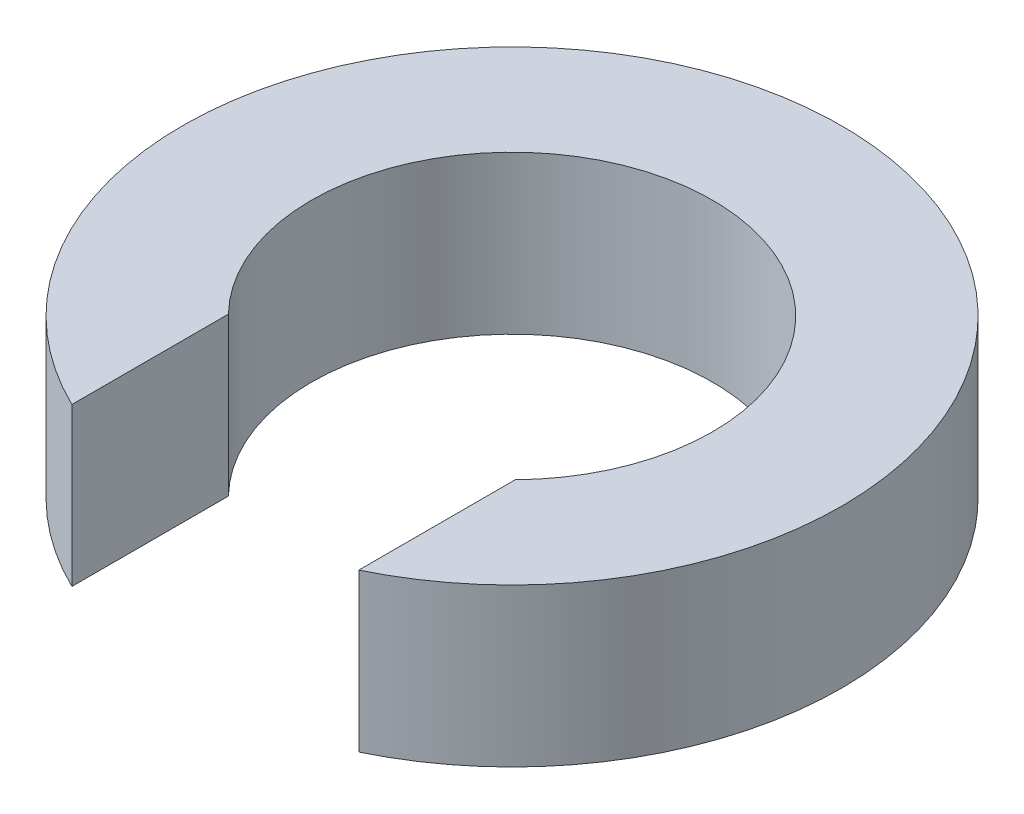
ISO-10303-21;
HEADER;
FILE_DESCRIPTION(('STEP AP214'),'2;1');
FILE_NAME('part.step','',(''),(''),'','','');
FILE_SCHEMA(('AUTOMOTIVE_DESIGN { 1 0 10303 214 1 1 1 1 }'));
ENDSEC;
DATA;
#1=APPLICATION_CONTEXT('core data for automotive mechanical design processes');
#2=APPLICATION_PROTOCOL_DEFINITION('international standard','automotive_design',2000,#1);
#3=PRODUCT_CONTEXT('',#1,'mechanical');
#4=PRODUCT('Part','Part','',(#3));
#5=PRODUCT_RELATED_PRODUCT_CATEGORY('part','',(#4));
#6=PRODUCT_DEFINITION_FORMATION('','',#4);
#7=PRODUCT_DEFINITION_CONTEXT('part definition',#1,'design');
#8=PRODUCT_DEFINITION('design','',#6,#7);
#9=PRODUCT_DEFINITION_SHAPE('','',#8);
#10=(LENGTH_UNIT() NAMED_UNIT(*) SI_UNIT(.MILLI.,.METRE.));
#11=(NAMED_UNIT(*) PLANE_ANGLE_UNIT() SI_UNIT($,.RADIAN.));
#12=(NAMED_UNIT(*) SI_UNIT($,.STERADIAN.) SOLID_ANGLE_UNIT());
#13=UNCERTAINTY_MEASURE_WITH_UNIT(LENGTH_MEASURE(1.E-05),#10,'distance_accuracy_value','');
#14=(GEOMETRIC_REPRESENTATION_CONTEXT(3) GLOBAL_UNCERTAINTY_ASSIGNED_CONTEXT((#13)) GLOBAL_UNIT_ASSIGNED_CONTEXT((#10,
#11,#12)) REPRESENTATION_CONTEXT('',''));
#15=CARTESIAN_POINT('',(0.,0.,0.));
#16=DIRECTION('',(0.,0.,1.));
#17=DIRECTION('',(1.,0.,0.));
#18=AXIS2_PLACEMENT_3D('',#15,#16,#17);
#19=CARTESIAN_POINT('',(0.,5.5,0.));
#20=DIRECTION('',(0.,1.,0.));
#21=DIRECTION('',(0.,0.,1.));
#22=AXIS2_PLACEMENT_3D('',#19,#20,#21);
#23=PLANE('',#22);
#24=DIRECTION('',(0.,0.,1.));
#25=VECTOR('',#24,1.);
#26=CARTESIAN_POINT('',(-5.00523934645971,5.5,4.89362637362638));
#27=LINE('',#26,#25);
#28=CARTESIAN_POINT('',(-5.00523934645971,5.5,4.89362637362638));
#29=VERTEX_POINT('',#28);
#30=CARTESIAN_POINT('',(-5.00523934645971,5.5,10.3536263736264));
#31=VERTEX_POINT('',#30);
#32=EDGE_CURVE('E122',#29,#31,#27,.T.);
#33=ORIENTED_EDGE('',*,*,#32,.F.);
#34=CARTESIAN_POINT('',(0.,5.5,0.));
#35=DIRECTION('',(0.,1.,0.));
#36=DIRECTION('',(0.,0.,1.));
#37=AXIS2_PLACEMENT_3D('',#34,#35,#36);
#38=CIRCLE('',#37,7.);
#39=CARTESIAN_POINT('',(5.00523934645971,5.5,4.89362637362638));
#40=VERTEX_POINT('',#39);
#41=EDGE_CURVE('E106',#40,#29,#38,.T.);
#42=ORIENTED_EDGE('',*,*,#41,.F.);
#43=DIRECTION('',(0.,0.,-1.));
#44=VECTOR('',#43,1.);
#45=CARTESIAN_POINT('',(5.00523934645971,5.5,4.89362637362638));
#46=LINE('',#45,#44);
#47=CARTESIAN_POINT('',(5.00523934645971,5.5,10.3536263736264));
#48=VERTEX_POINT('',#47);
#49=EDGE_CURVE('E69',#48,#40,#46,.T.);
#50=ORIENTED_EDGE('',*,*,#49,.F.);
#51=CARTESIAN_POINT('',(0.,5.5,0.));
#52=DIRECTION('',(0.,1.,0.));
#53=DIRECTION('',(0.,0.,1.));
#54=AXIS2_PLACEMENT_3D('',#51,#52,#53);
#55=CIRCLE('',#54,11.5);
#56=EDGE_CURVE('E11',#48,#31,#55,.T.);
#57=ORIENTED_EDGE('',*,*,#56,.T.);
#58=EDGE_LOOP('',(#33,#42,#50,#57));
#59=FACE_BOUND('',#58,.T.);
#60=ADVANCED_FACE('F45',(#59),#23,.T.);
#61=CARTESIAN_POINT('',(0.,0.,0.));
#62=DIRECTION('',(0.,1.,0.));
#63=DIRECTION('',(0.,0.,1.));
#64=AXIS2_PLACEMENT_3D('',#61,#62,#63);
#65=PLANE('',#64);
#66=CARTESIAN_POINT('',(0.,0.,0.));
#67=DIRECTION('',(0.,1.,0.));
#68=DIRECTION('',(0.,0.,1.));
#69=AXIS2_PLACEMENT_3D('',#66,#67,#68);
#70=CIRCLE('',#69,7.);
#71=CARTESIAN_POINT('',(5.00523934645971,0.,4.89362637362638));
#72=VERTEX_POINT('',#71);
#73=CARTESIAN_POINT('',(-5.00523934645971,0.,4.89362637362638));
#74=VERTEX_POINT('',#73);
#75=EDGE_CURVE('E100',#72,#74,#70,.T.);
#76=ORIENTED_EDGE('',*,*,#75,.T.);
#77=DIRECTION('',(0.,0.,1.));
#78=VECTOR('',#77,1.);
#79=CARTESIAN_POINT('',(-5.00523934645971,0.,4.89362637362638));
#80=LINE('',#79,#78);
#81=CARTESIAN_POINT('',(-5.00523934645971,0.,10.3536263736264));
#82=VERTEX_POINT('',#81);
#83=EDGE_CURVE('E61',#74,#82,#80,.T.);
#84=ORIENTED_EDGE('',*,*,#83,.T.);
#85=CARTESIAN_POINT('',(0.,0.,0.));
#86=DIRECTION('',(0.,1.,0.));
#87=DIRECTION('',(0.,0.,1.));
#88=AXIS2_PLACEMENT_3D('',#85,#86,#87);
#89=CIRCLE('',#88,11.5);
#90=CARTESIAN_POINT('',(5.00523934645971,0.,10.3536263736264));
#91=VERTEX_POINT('',#90);
#92=EDGE_CURVE('E49',#91,#82,#89,.T.);
#93=ORIENTED_EDGE('',*,*,#92,.F.);
#94=DIRECTION('',(0.,0.,-1.));
#95=VECTOR('',#94,1.);
#96=CARTESIAN_POINT('',(5.00523934645971,0.,4.89362637362638));
#97=LINE('',#96,#95);
#98=EDGE_CURVE('E87',#91,#72,#97,.T.);
#99=ORIENTED_EDGE('',*,*,#98,.T.);
#100=EDGE_LOOP('',(#76,#84,#93,#99));
#101=FACE_BOUND('',#100,.T.);
#102=ADVANCED_FACE('F99',(#101),#65,.F.);
#103=CARTESIAN_POINT('',(0.,5.5,0.));
#104=DIRECTION('',(0.,-1.,0.));
#105=DIRECTION('',(0.,0.,-1.));
#106=AXIS2_PLACEMENT_3D('',#103,#104,#105);
#107=CYLINDRICAL_SURFACE('',#106,11.5);
#108=ORIENTED_EDGE('',*,*,#92,.T.);
#109=DIRECTION('',(0.,-1.,0.));
#110=VECTOR('',#109,1.);
#111=CARTESIAN_POINT('',(-5.00523934645971,5.5,10.3536263736264));
#112=LINE('',#111,#110);
#113=EDGE_CURVE('E107',#82,#31,#112,.F.);
#114=ORIENTED_EDGE('',*,*,#113,.T.);
#115=ORIENTED_EDGE('',*,*,#56,.F.);
#116=DIRECTION('',(0.,-1.,0.));
#117=VECTOR('',#116,1.);
#118=CARTESIAN_POINT('',(5.00523934645971,5.5,10.3536263736264));
#119=LINE('',#118,#117);
#120=EDGE_CURVE('E113',#48,#91,#119,.T.);
#121=ORIENTED_EDGE('',*,*,#120,.T.);
#122=EDGE_LOOP('',(#108,#114,#115,#121));
#123=FACE_BOUND('',#122,.T.);
#124=ADVANCED_FACE('F47',(#123),#107,.T.);
#125=CARTESIAN_POINT('',(0.,5.5,0.));
#126=DIRECTION('',(0.,-1.,0.));
#127=DIRECTION('',(0.,0.,-1.));
#128=AXIS2_PLACEMENT_3D('',#125,#126,#127);
#129=CYLINDRICAL_SURFACE('',#128,7.);
#130=DIRECTION('',(0.,1.,0.));
#131=VECTOR('',#130,1.);
#132=CARTESIAN_POINT('',(-5.00523934645971,0.,4.89362637362638));
#133=LINE('',#132,#131);
#134=EDGE_CURVE('E94',#74,#29,#133,.T.);
#135=ORIENTED_EDGE('',*,*,#134,.F.);
#136=ORIENTED_EDGE('',*,*,#75,.F.);
#137=DIRECTION('',(0.,1.,0.));
#138=VECTOR('',#137,1.);
#139=CARTESIAN_POINT('',(5.00523934645971,0.,4.89362637362638));
#140=LINE('',#139,#138);
#141=EDGE_CURVE('E84',#72,#40,#140,.T.);
#142=ORIENTED_EDGE('',*,*,#141,.T.);
#143=ORIENTED_EDGE('',*,*,#41,.T.);
#144=EDGE_LOOP('',(#135,#136,#142,#143));
#145=FACE_BOUND('',#144,.T.);
#146=ADVANCED_FACE('F104',(#145),#129,.F.);
#147=CARTESIAN_POINT('',(5.00523934645971,0.,4.89362637362638));
#148=DIRECTION('',(1.,0.,0.));
#149=DIRECTION('',(0.,0.,-1.));
#150=AXIS2_PLACEMENT_3D('',#147,#148,#149);
#151=PLANE('',#150);
#152=ORIENTED_EDGE('',*,*,#49,.T.);
#153=ORIENTED_EDGE('',*,*,#141,.F.);
#154=ORIENTED_EDGE('',*,*,#98,.F.);
#155=ORIENTED_EDGE('',*,*,#120,.F.);
#156=EDGE_LOOP('',(#152,#153,#154,#155));
#157=FACE_BOUND('',#156,.T.);
#158=ADVANCED_FACE('F86',(#157),#151,.F.);
#159=CARTESIAN_POINT('',(-5.00523934645971,0.,4.89362637362638));
#160=DIRECTION('',(-1.,0.,0.));
#161=DIRECTION('',(0.,0.,1.));
#162=AXIS2_PLACEMENT_3D('',#159,#160,#161);
#163=PLANE('',#162);
#164=ORIENTED_EDGE('',*,*,#83,.F.);
#165=ORIENTED_EDGE('',*,*,#134,.T.);
#166=ORIENTED_EDGE('',*,*,#32,.T.);
#167=ORIENTED_EDGE('',*,*,#113,.F.);
#168=EDGE_LOOP('',(#164,#165,#166,#167));
#169=FACE_BOUND('',#168,.T.);
#170=ADVANCED_FACE('F131',(#169),#163,.F.);
#171=CLOSED_SHELL('',(#60,#102,#124,#146,#158,#170));
#172=MANIFOLD_SOLID_BREP('B2',#171);
#173=ADVANCED_BREP_SHAPE_REPRESENTATION('',(#18,#172),#14);
#174=SHAPE_DEFINITION_REPRESENTATION(#9,#173);
ENDSEC;
END-ISO-10303-21;
